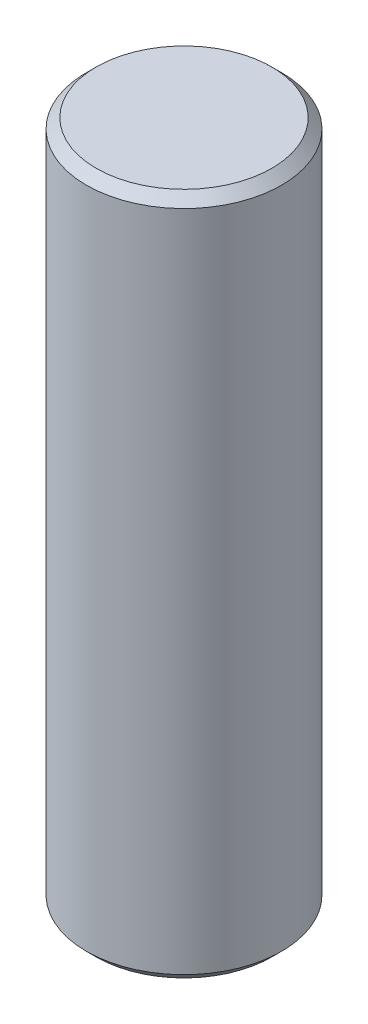
ISO-10303-21;
HEADER;
FILE_DESCRIPTION(('STEP AP214'),'2;1');
FILE_NAME('part.step','',(''),(''),'','','');
FILE_SCHEMA(('AUTOMOTIVE_DESIGN { 1 0 10303 214 1 1 1 1 }'));
ENDSEC;
DATA;
#1=APPLICATION_CONTEXT('core data for automotive mechanical design processes');
#2=APPLICATION_PROTOCOL_DEFINITION('international standard','automotive_design',2000,#1);
#3=PRODUCT_CONTEXT('',#1,'mechanical');
#4=PRODUCT('Part','Part','',(#3));
#5=PRODUCT_RELATED_PRODUCT_CATEGORY('part','',(#4));
#6=PRODUCT_DEFINITION_FORMATION('','',#4);
#7=PRODUCT_DEFINITION_CONTEXT('part definition',#1,'design');
#8=PRODUCT_DEFINITION('design','',#6,#7);
#9=PRODUCT_DEFINITION_SHAPE('','',#8);
#10=(LENGTH_UNIT() NAMED_UNIT(*) SI_UNIT(.MILLI.,.METRE.));
#11=(NAMED_UNIT(*) PLANE_ANGLE_UNIT() SI_UNIT($,.RADIAN.));
#12=(NAMED_UNIT(*) SI_UNIT($,.STERADIAN.) SOLID_ANGLE_UNIT());
#13=UNCERTAINTY_MEASURE_WITH_UNIT(LENGTH_MEASURE(1.E-05),#10,'distance_accuracy_value','');
#14=(GEOMETRIC_REPRESENTATION_CONTEXT(3) GLOBAL_UNCERTAINTY_ASSIGNED_CONTEXT((#13)) GLOBAL_UNIT_ASSIGNED_CONTEXT((#10,
#11,#12)) REPRESENTATION_CONTEXT('',''));
#15=CARTESIAN_POINT('',(0.,0.,0.));
#16=DIRECTION('',(0.,0.,1.));
#17=DIRECTION('',(1.,0.,0.));
#18=AXIS2_PLACEMENT_3D('',#15,#16,#17);
#19=CARTESIAN_POINT('',(0.,7.,0.));
#20=DIRECTION('',(0.,-1.,0.));
#21=DIRECTION('',(0.,0.,-1.));
#22=AXIS2_PLACEMENT_3D('',#19,#20,#21);
#23=CYLINDRICAL_SURFACE('',#22,2.);
#24=CARTESIAN_POINT('',(0.,-6.8,0.));
#25=DIRECTION('',(0.,1.,0.));
#26=DIRECTION('',(0.,0.,1.));
#27=AXIS2_PLACEMENT_3D('',#24,#25,#26);
#28=CIRCLE('',#27,2.);
#29=CARTESIAN_POINT('',(0.,-6.8,2.));
#30=VERTEX_POINT('',#29);
#31=EDGE_CURVE('E41',#30,#30,#28,.T.);
#32=ORIENTED_EDGE('',*,*,#31,.T.);
#33=EDGE_LOOP('',(#32));
#34=FACE_BOUND('',#33,.T.);
#35=CARTESIAN_POINT('',(0.,6.8,0.));
#36=DIRECTION('',(0.,1.,0.));
#37=DIRECTION('',(0.,0.,1.));
#38=AXIS2_PLACEMENT_3D('',#35,#36,#37);
#39=CIRCLE('',#38,2.);
#40=CARTESIAN_POINT('',(0.,6.8,2.));
#41=VERTEX_POINT('',#40);
#42=EDGE_CURVE('E45',#41,#41,#39,.F.);
#43=ORIENTED_EDGE('',*,*,#42,.T.);
#44=EDGE_LOOP('',(#43));
#45=FACE_BOUND('',#44,.T.);
#46=ADVANCED_FACE('F30',(#34,#45),#23,.T.);
#47=CARTESIAN_POINT('',(0.,7.,0.));
#48=DIRECTION('',(0.,1.,0.));
#49=DIRECTION('',(0.,0.,1.));
#50=AXIS2_PLACEMENT_3D('',#47,#48,#49);
#51=PLANE('',#50);
#52=CARTESIAN_POINT('',(0.,7.,0.));
#53=DIRECTION('',(0.,1.,0.));
#54=DIRECTION('',(0.,0.,1.));
#55=AXIS2_PLACEMENT_3D('',#52,#53,#54);
#56=CIRCLE('',#55,1.8);
#57=CARTESIAN_POINT('',(0.,7.,1.8));
#58=VERTEX_POINT('',#57);
#59=EDGE_CURVE('E10',#58,#58,#56,.T.);
#60=ORIENTED_EDGE('',*,*,#59,.T.);
#61=EDGE_LOOP('',(#60));
#62=FACE_BOUND('',#61,.T.);
#63=ADVANCED_FACE('F61',(#62),#51,.T.);
#64=CARTESIAN_POINT('',(0.,-7.,0.));
#65=DIRECTION('',(0.,1.,0.));
#66=DIRECTION('',(0.,0.,1.));
#67=AXIS2_PLACEMENT_3D('',#64,#65,#66);
#68=PLANE('',#67);
#69=CARTESIAN_POINT('',(0.,-7.,0.));
#70=DIRECTION('',(0.,1.,0.));
#71=DIRECTION('',(0.,0.,1.));
#72=AXIS2_PLACEMENT_3D('',#69,#70,#71);
#73=CIRCLE('',#72,1.8);
#74=CARTESIAN_POINT('',(0.,-7.,1.8));
#75=VERTEX_POINT('',#74);
#76=EDGE_CURVE('E37',#75,#75,#73,.F.);
#77=ORIENTED_EDGE('',*,*,#76,.T.);
#78=EDGE_LOOP('',(#77));
#79=FACE_BOUND('',#78,.T.);
#80=ADVANCED_FACE('F58',(#79),#68,.F.);
#81=CARTESIAN_POINT('',(0.,-6.8,0.));
#82=DIRECTION('',(0.,1.,0.));
#83=DIRECTION('',(0.,0.,1.));
#84=AXIS2_PLACEMENT_3D('',#81,#82,#83);
#85=CONICAL_SURFACE('',#84,2.,0.785398163397448);
#86=ORIENTED_EDGE('',*,*,#76,.F.);
#87=EDGE_LOOP('',(#86));
#88=FACE_BOUND('',#87,.T.);
#89=ORIENTED_EDGE('',*,*,#31,.F.);
#90=EDGE_LOOP('',(#89));
#91=FACE_BOUND('',#90,.T.);
#92=ADVANCED_FACE('F54',(#88,#91),#85,.T.);
#93=CARTESIAN_POINT('',(0.,7.,0.));
#94=DIRECTION('',(0.,-1.,0.));
#95=DIRECTION('',(0.,0.,-1.));
#96=AXIS2_PLACEMENT_3D('',#93,#94,#95);
#97=CONICAL_SURFACE('',#96,1.8,0.785398163397444);
#98=ORIENTED_EDGE('',*,*,#42,.F.);
#99=EDGE_LOOP('',(#98));
#100=FACE_BOUND('',#99,.T.);
#101=ORIENTED_EDGE('',*,*,#59,.F.);
#102=EDGE_LOOP('',(#101));
#103=FACE_BOUND('',#102,.T.);
#104=ADVANCED_FACE('F32',(#100,#103),#97,.T.);
#105=CLOSED_SHELL('',(#46,#63,#80,#92,#104));
#106=MANIFOLD_SOLID_BREP('B2',#105);
#107=ADVANCED_BREP_SHAPE_REPRESENTATION('',(#18,#106),#14);
#108=SHAPE_DEFINITION_REPRESENTATION(#9,#107);
ENDSEC;
END-ISO-10303-21;
